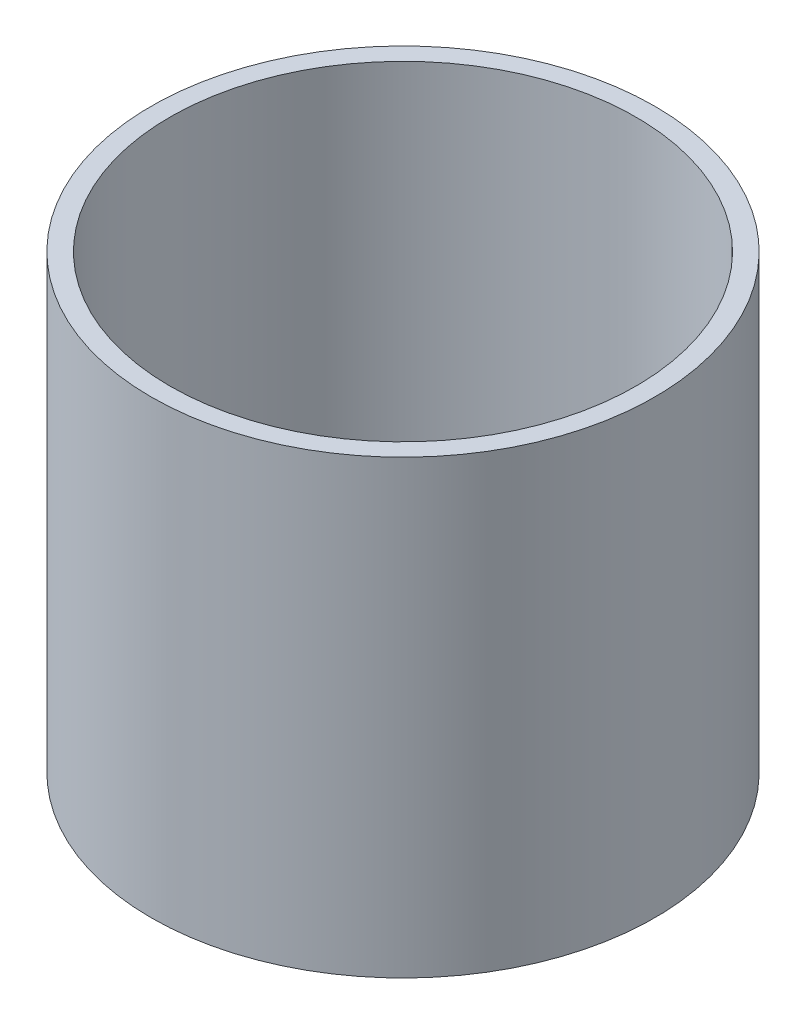
ISO-10303-21;
HEADER;
FILE_DESCRIPTION(('STEP AP214'),'2;1');
FILE_NAME('part.step','',(''),(''),'','','');
FILE_SCHEMA(('AUTOMOTIVE_DESIGN { 1 0 10303 214 1 1 1 1 }'));
ENDSEC;
DATA;
#1=APPLICATION_CONTEXT('core data for automotive mechanical design processes');
#2=APPLICATION_PROTOCOL_DEFINITION('international standard','automotive_design',2000,#1);
#3=PRODUCT_CONTEXT('',#1,'mechanical');
#4=PRODUCT('Part','Part','',(#3));
#5=PRODUCT_RELATED_PRODUCT_CATEGORY('part','',(#4));
#6=PRODUCT_DEFINITION_FORMATION('','',#4);
#7=PRODUCT_DEFINITION_CONTEXT('part definition',#1,'design');
#8=PRODUCT_DEFINITION('design','',#6,#7);
#9=PRODUCT_DEFINITION_SHAPE('','',#8);
#10=(LENGTH_UNIT() NAMED_UNIT(*) SI_UNIT(.MILLI.,.METRE.));
#11=(NAMED_UNIT(*) PLANE_ANGLE_UNIT() SI_UNIT($,.RADIAN.));
#12=(NAMED_UNIT(*) SI_UNIT($,.STERADIAN.) SOLID_ANGLE_UNIT());
#13=UNCERTAINTY_MEASURE_WITH_UNIT(LENGTH_MEASURE(1.E-05),#10,'distance_accuracy_value','');
#14=(GEOMETRIC_REPRESENTATION_CONTEXT(3) GLOBAL_UNCERTAINTY_ASSIGNED_CONTEXT((#13)) GLOBAL_UNIT_ASSIGNED_CONTEXT((#10,
#11,#12)) REPRESENTATION_CONTEXT('',''));
#15=CARTESIAN_POINT('',(0.,0.,0.));
#16=DIRECTION('',(0.,0.,1.));
#17=DIRECTION('',(1.,0.,0.));
#18=AXIS2_PLACEMENT_3D('',#15,#16,#17);
#19=CARTESIAN_POINT('',(0.,60.,0.));
#20=DIRECTION('',(0.,1.,0.));
#21=DIRECTION('',(0.,0.,1.));
#22=AXIS2_PLACEMENT_3D('',#19,#20,#21);
#23=PLANE('',#22);
#24=CARTESIAN_POINT('',(0.,60.,0.));
#25=DIRECTION('',(0.,1.,0.));
#26=DIRECTION('',(0.,0.,1.));
#27=AXIS2_PLACEMENT_3D('',#24,#25,#26);
#28=CIRCLE('',#27,33.5);
#29=CARTESIAN_POINT('',(0.,60.,33.5));
#30=VERTEX_POINT('',#29);
#31=EDGE_CURVE('E10',#30,#30,#28,.T.);
#32=ORIENTED_EDGE('',*,*,#31,.T.);
#33=EDGE_LOOP('',(#32));
#34=FACE_BOUND('',#33,.T.);
#35=CARTESIAN_POINT('',(0.,60.,0.));
#36=DIRECTION('',(0.,1.,0.));
#37=DIRECTION('',(0.,0.,1.));
#38=AXIS2_PLACEMENT_3D('',#35,#36,#37);
#39=CIRCLE('',#38,31.);
#40=CARTESIAN_POINT('',(0.,60.,31.));
#41=VERTEX_POINT('',#40);
#42=EDGE_CURVE('E41',#41,#41,#39,.T.);
#43=ORIENTED_EDGE('',*,*,#42,.F.);
#44=EDGE_LOOP('',(#43));
#45=FACE_BOUND('',#44,.T.);
#46=ADVANCED_FACE('F30',(#34,#45),#23,.T.);
#47=CARTESIAN_POINT('',(0.,0.,0.));
#48=DIRECTION('',(0.,1.,0.));
#49=DIRECTION('',(0.,0.,1.));
#50=AXIS2_PLACEMENT_3D('',#47,#48,#49);
#51=PLANE('',#50);
#52=CARTESIAN_POINT('',(0.,0.,0.));
#53=DIRECTION('',(0.,1.,0.));
#54=DIRECTION('',(0.,0.,1.));
#55=AXIS2_PLACEMENT_3D('',#52,#53,#54);
#56=CIRCLE('',#55,33.5);
#57=CARTESIAN_POINT('',(0.,0.,33.5));
#58=VERTEX_POINT('',#57);
#59=EDGE_CURVE('E34',#58,#58,#56,.T.);
#60=ORIENTED_EDGE('',*,*,#59,.F.);
#61=EDGE_LOOP('',(#60));
#62=FACE_BOUND('',#61,.T.);
#63=CARTESIAN_POINT('',(0.,0.,0.));
#64=DIRECTION('',(0.,1.,0.));
#65=DIRECTION('',(0.,0.,1.));
#66=AXIS2_PLACEMENT_3D('',#63,#64,#65);
#67=CIRCLE('',#66,31.);
#68=CARTESIAN_POINT('',(0.,0.,31.));
#69=VERTEX_POINT('',#68);
#70=EDGE_CURVE('E43',#69,#69,#67,.T.);
#71=ORIENTED_EDGE('',*,*,#70,.T.);
#72=EDGE_LOOP('',(#71));
#73=FACE_BOUND('',#72,.T.);
#74=ADVANCED_FACE('F53',(#62,#73),#51,.F.);
#75=CARTESIAN_POINT('',(0.,60.,0.));
#76=DIRECTION('',(0.,-1.,0.));
#77=DIRECTION('',(0.,0.,-1.));
#78=AXIS2_PLACEMENT_3D('',#75,#76,#77);
#79=CYLINDRICAL_SURFACE('',#78,33.5);
#80=ORIENTED_EDGE('',*,*,#31,.F.);
#81=EDGE_LOOP('',(#80));
#82=FACE_BOUND('',#81,.T.);
#83=ORIENTED_EDGE('',*,*,#59,.T.);
#84=EDGE_LOOP('',(#83));
#85=FACE_BOUND('',#84,.T.);
#86=ADVANCED_FACE('F32',(#82,#85),#79,.T.);
#87=CARTESIAN_POINT('',(0.,60.,0.));
#88=DIRECTION('',(0.,-1.,0.));
#89=DIRECTION('',(0.,0.,-1.));
#90=AXIS2_PLACEMENT_3D('',#87,#88,#89);
#91=CYLINDRICAL_SURFACE('',#90,31.);
#92=ORIENTED_EDGE('',*,*,#42,.T.);
#93=EDGE_LOOP('',(#92));
#94=FACE_BOUND('',#93,.T.);
#95=ORIENTED_EDGE('',*,*,#70,.F.);
#96=EDGE_LOOP('',(#95));
#97=FACE_BOUND('',#96,.T.);
#98=ADVANCED_FACE('F49',(#94,#97),#91,.F.);
#99=CLOSED_SHELL('',(#46,#74,#86,#98));
#100=MANIFOLD_SOLID_BREP('B2',#99);
#101=ADVANCED_BREP_SHAPE_REPRESENTATION('',(#18,#100),#14);
#102=SHAPE_DEFINITION_REPRESENTATION(#9,#101);
ENDSEC;
END-ISO-10303-21;
